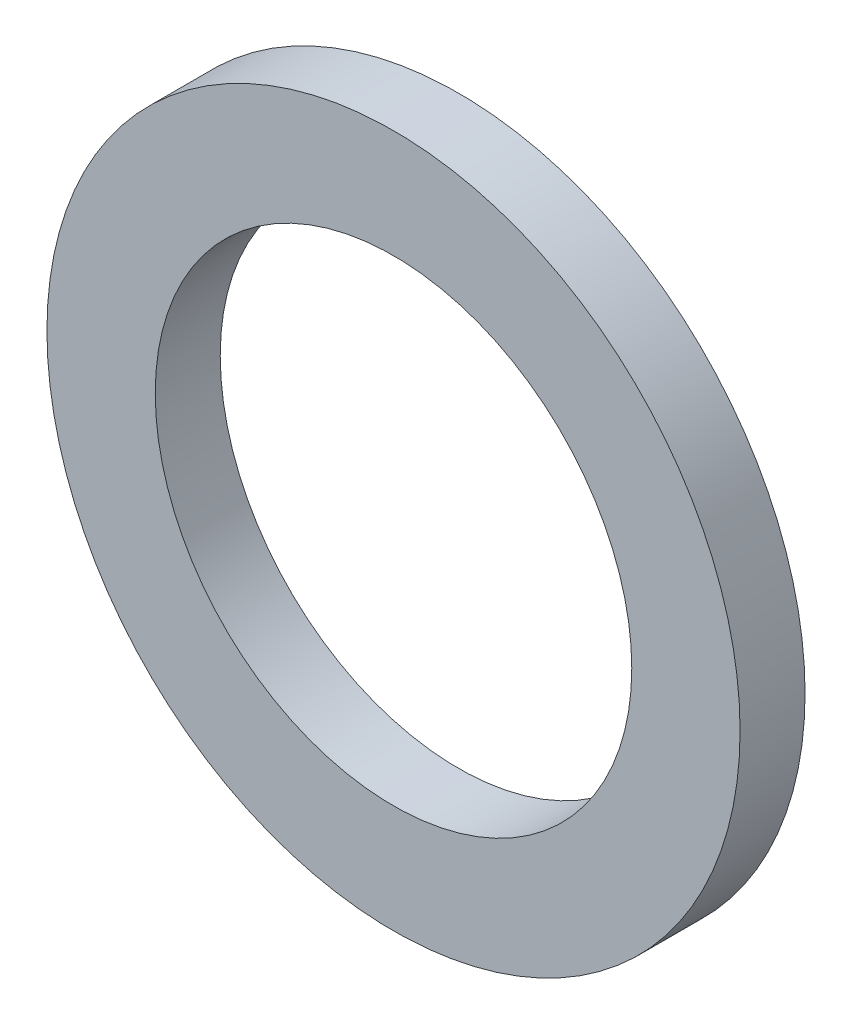
ISO-10303-21;
HEADER;
FILE_DESCRIPTION(('STEP AP214'),'2;1');
FILE_NAME('part.step','',(''),(''),'','','');
FILE_SCHEMA(('AUTOMOTIVE_DESIGN { 1 0 10303 214 1 1 1 1 }'));
ENDSEC;
DATA;
#1=APPLICATION_CONTEXT('core data for automotive mechanical design processes');
#2=APPLICATION_PROTOCOL_DEFINITION('international standard','automotive_design',2000,#1);
#3=PRODUCT_CONTEXT('',#1,'mechanical');
#4=PRODUCT('Part','Part','',(#3));
#5=PRODUCT_RELATED_PRODUCT_CATEGORY('part','',(#4));
#6=PRODUCT_DEFINITION_FORMATION('','',#4);
#7=PRODUCT_DEFINITION_CONTEXT('part definition',#1,'design');
#8=PRODUCT_DEFINITION('design','',#6,#7);
#9=PRODUCT_DEFINITION_SHAPE('','',#8);
#10=(LENGTH_UNIT() NAMED_UNIT(*) SI_UNIT(.MILLI.,.METRE.));
#11=(NAMED_UNIT(*) PLANE_ANGLE_UNIT() SI_UNIT($,.RADIAN.));
#12=(NAMED_UNIT(*) SI_UNIT($,.STERADIAN.) SOLID_ANGLE_UNIT());
#13=UNCERTAINTY_MEASURE_WITH_UNIT(LENGTH_MEASURE(1.E-05),#10,'distance_accuracy_value','');
#14=(GEOMETRIC_REPRESENTATION_CONTEXT(3) GLOBAL_UNCERTAINTY_ASSIGNED_CONTEXT((#13)) GLOBAL_UNIT_ASSIGNED_CONTEXT((#10,
#11,#12)) REPRESENTATION_CONTEXT('',''));
#15=CARTESIAN_POINT('',(0.,0.,0.));
#16=DIRECTION('',(0.,0.,1.));
#17=DIRECTION('',(1.,0.,0.));
#18=AXIS2_PLACEMENT_3D('',#15,#16,#17);
#19=CARTESIAN_POINT('',(0.,0.,1.5));
#20=DIRECTION('',(0.,0.,1.));
#21=DIRECTION('',(1.,0.,0.));
#22=AXIS2_PLACEMENT_3D('',#19,#20,#21);
#23=PLANE('',#22);
#24=CARTESIAN_POINT('',(0.,0.,1.5));
#25=DIRECTION('',(0.,0.,1.));
#26=DIRECTION('',(1.,0.,0.));
#27=AXIS2_PLACEMENT_3D('',#24,#25,#26);
#28=CIRCLE('',#27,8.);
#29=CARTESIAN_POINT('',(8.,0.,1.5));
#30=VERTEX_POINT('',#29);
#31=EDGE_CURVE('E10',#30,#30,#28,.T.);
#32=ORIENTED_EDGE('',*,*,#31,.T.);
#33=EDGE_LOOP('',(#32));
#34=FACE_BOUND('',#33,.T.);
#35=CARTESIAN_POINT('',(0.,0.,1.5));
#36=DIRECTION('',(0.,0.,1.));
#37=DIRECTION('',(1.,0.,0.));
#38=AXIS2_PLACEMENT_3D('',#35,#36,#37);
#39=CIRCLE('',#38,5.5);
#40=CARTESIAN_POINT('',(5.5,0.,1.5));
#41=VERTEX_POINT('',#40);
#42=EDGE_CURVE('E43',#41,#41,#39,.T.);
#43=ORIENTED_EDGE('',*,*,#42,.F.);
#44=EDGE_LOOP('',(#43));
#45=FACE_BOUND('',#44,.T.);
#46=ADVANCED_FACE('F32',(#34,#45),#23,.T.);
#47=CARTESIAN_POINT('',(0.,0.,0.));
#48=DIRECTION('',(0.,0.,1.));
#49=DIRECTION('',(1.,0.,0.));
#50=AXIS2_PLACEMENT_3D('',#47,#48,#49);
#51=PLANE('',#50);
#52=CARTESIAN_POINT('',(0.,0.,0.));
#53=DIRECTION('',(0.,0.,1.));
#54=DIRECTION('',(1.,0.,0.));
#55=AXIS2_PLACEMENT_3D('',#52,#53,#54);
#56=CIRCLE('',#55,8.);
#57=CARTESIAN_POINT('',(8.,0.,0.));
#58=VERTEX_POINT('',#57);
#59=EDGE_CURVE('E36',#58,#58,#56,.T.);
#60=ORIENTED_EDGE('',*,*,#59,.F.);
#61=EDGE_LOOP('',(#60));
#62=FACE_BOUND('',#61,.T.);
#63=CARTESIAN_POINT('',(0.,0.,0.));
#64=DIRECTION('',(0.,0.,1.));
#65=DIRECTION('',(1.,0.,0.));
#66=AXIS2_PLACEMENT_3D('',#63,#64,#65);
#67=CIRCLE('',#66,5.5);
#68=CARTESIAN_POINT('',(5.5,0.,0.));
#69=VERTEX_POINT('',#68);
#70=EDGE_CURVE('E45',#69,#69,#67,.T.);
#71=ORIENTED_EDGE('',*,*,#70,.T.);
#72=EDGE_LOOP('',(#71));
#73=FACE_BOUND('',#72,.T.);
#74=ADVANCED_FACE('F55',(#62,#73),#51,.F.);
#75=CARTESIAN_POINT('',(0.,0.,1.5));
#76=DIRECTION('',(0.,0.,-1.));
#77=DIRECTION('',(-1.,0.,0.));
#78=AXIS2_PLACEMENT_3D('',#75,#76,#77);
#79=CYLINDRICAL_SURFACE('',#78,8.);
#80=ORIENTED_EDGE('',*,*,#31,.F.);
#81=EDGE_LOOP('',(#80));
#82=FACE_BOUND('',#81,.T.);
#83=ORIENTED_EDGE('',*,*,#59,.T.);
#84=EDGE_LOOP('',(#83));
#85=FACE_BOUND('',#84,.T.);
#86=ADVANCED_FACE('F34',(#82,#85),#79,.T.);
#87=CARTESIAN_POINT('',(0.,0.,1.5));
#88=DIRECTION('',(0.,0.,-1.));
#89=DIRECTION('',(-1.,0.,0.));
#90=AXIS2_PLACEMENT_3D('',#87,#88,#89);
#91=CYLINDRICAL_SURFACE('',#90,5.5);
#92=ORIENTED_EDGE('',*,*,#42,.T.);
#93=EDGE_LOOP('',(#92));
#94=FACE_BOUND('',#93,.T.);
#95=ORIENTED_EDGE('',*,*,#70,.F.);
#96=EDGE_LOOP('',(#95));
#97=FACE_BOUND('',#96,.T.);
#98=ADVANCED_FACE('F51',(#94,#97),#91,.F.);
#99=CLOSED_SHELL('',(#46,#74,#86,#98));
#100=MANIFOLD_SOLID_BREP('B2',#99);
#101=ADVANCED_BREP_SHAPE_REPRESENTATION('',(#18,#100),#14);
#102=SHAPE_DEFINITION_REPRESENTATION(#9,#101);
ENDSEC;
END-ISO-10303-21;
